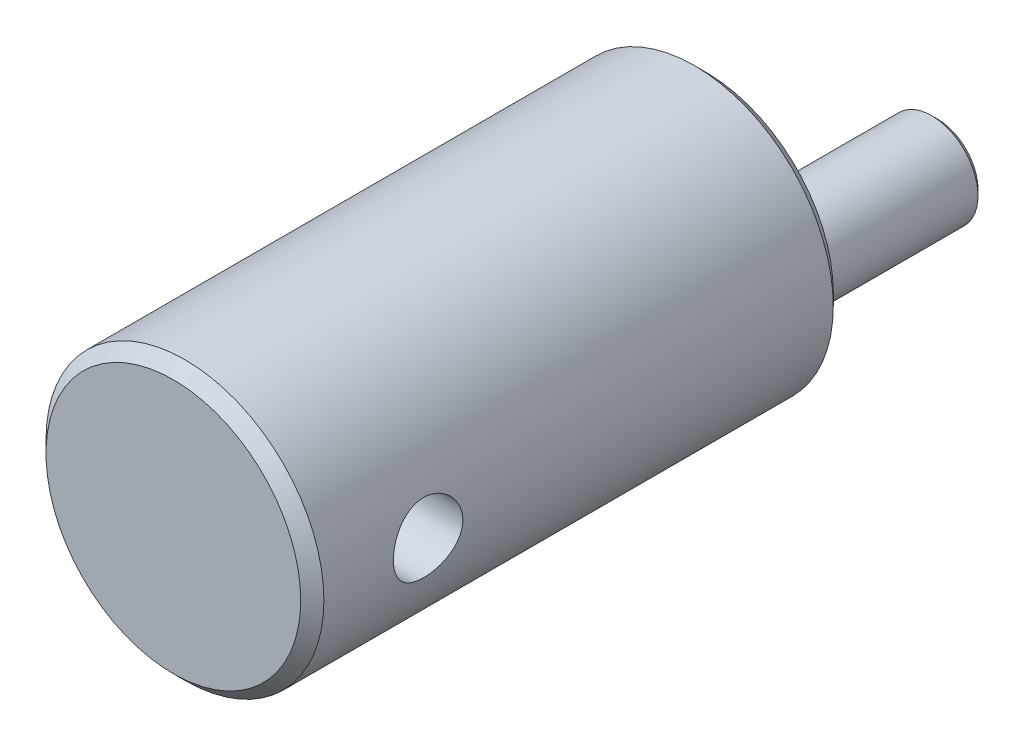
ISO-10303-21;
HEADER;
FILE_DESCRIPTION(('STEP AP214'),'2;1');
FILE_NAME('part.step','',(''),(''),'','','');
FILE_SCHEMA(('AUTOMOTIVE_DESIGN { 1 0 10303 214 1 1 1 1 }'));
ENDSEC;
DATA;
#1=APPLICATION_CONTEXT('core data for automotive mechanical design processes');
#2=APPLICATION_PROTOCOL_DEFINITION('international standard','automotive_design',2000,#1);
#3=PRODUCT_CONTEXT('',#1,'mechanical');
#4=PRODUCT('Part','Part','',(#3));
#5=PRODUCT_RELATED_PRODUCT_CATEGORY('part','',(#4));
#6=PRODUCT_DEFINITION_FORMATION('','',#4);
#7=PRODUCT_DEFINITION_CONTEXT('part definition',#1,'design');
#8=PRODUCT_DEFINITION('design','',#6,#7);
#9=PRODUCT_DEFINITION_SHAPE('','',#8);
#10=(LENGTH_UNIT() NAMED_UNIT(*) SI_UNIT(.MILLI.,.METRE.));
#11=(NAMED_UNIT(*) PLANE_ANGLE_UNIT() SI_UNIT($,.RADIAN.));
#12=(NAMED_UNIT(*) SI_UNIT($,.STERADIAN.) SOLID_ANGLE_UNIT());
#13=UNCERTAINTY_MEASURE_WITH_UNIT(LENGTH_MEASURE(1.E-05),#10,'distance_accuracy_value','');
#14=(GEOMETRIC_REPRESENTATION_CONTEXT(3) GLOBAL_UNCERTAINTY_ASSIGNED_CONTEXT((#13)) GLOBAL_UNIT_ASSIGNED_CONTEXT((#10,
#11,#12)) REPRESENTATION_CONTEXT('',''));
#15=CARTESIAN_POINT('',(0.,0.,0.));
#16=DIRECTION('',(0.,0.,1.));
#17=DIRECTION('',(1.,0.,0.));
#18=AXIS2_PLACEMENT_3D('',#15,#16,#17);
#19=CARTESIAN_POINT('',(0.,0.,23.));
#20=DIRECTION('',(0.,0.,-1.));
#21=DIRECTION('',(-1.,0.,0.));
#22=AXIS2_PLACEMENT_3D('',#19,#20,#21);
#23=CYLINDRICAL_SURFACE('',#22,6.);
#24=CARTESIAN_POINT('',(0.,0.,0.5));
#25=DIRECTION('',(0.,0.,1.));
#26=DIRECTION('',(1.,0.,0.));
#27=AXIS2_PLACEMENT_3D('',#24,#25,#26);
#28=CIRCLE('',#27,6.);
#29=CARTESIAN_POINT('',(6.,0.,0.5));
#30=VERTEX_POINT('',#29);
#31=EDGE_CURVE('E108',#30,#30,#28,.T.);
#32=ORIENTED_EDGE('',*,*,#31,.T.);
#33=EDGE_LOOP('',(#32));
#34=FACE_BOUND('',#33,.T.);
#35=CARTESIAN_POINT('',(0.,0.,22.5));
#36=DIRECTION('',(0.,0.,1.));
#37=DIRECTION('',(1.,0.,0.));
#38=AXIS2_PLACEMENT_3D('',#35,#36,#37);
#39=CIRCLE('',#38,6.);
#40=CARTESIAN_POINT('',(6.,0.,22.5));
#41=VERTEX_POINT('',#40);
#42=EDGE_CURVE('E70',#41,#41,#39,.F.);
#43=ORIENTED_EDGE('',*,*,#42,.T.);
#44=EDGE_LOOP('',(#43));
#45=FACE_BOUND('',#44,.T.);
#46=CARTESIAN_POINT('',(-6.,0.,19.5));
#47=CARTESIAN_POINT('',(-5.99999859868012,0.082876088669731,19.4999976742618));
#48=CARTESIAN_POINT('',(-5.99826578131828,0.165778157830763,19.4931084492262));
#49=CARTESIAN_POINT('',(-5.99152113829892,0.329206323770533,19.465774848693));
#50=CARTESIAN_POINT('',(-5.98650745419968,0.409731046870739,19.4453227904621));
#51=CARTESIAN_POINT('',(-5.9737562633204,0.566020872182577,19.3915607465379));
#52=CARTESIAN_POINT('',(-5.96602202842087,0.641791563430003,19.3582662012847));
#53=CARTESIAN_POINT('',(-5.94865343807593,0.786672131904426,19.2798186099552));
#54=CARTESIAN_POINT('',(-5.9390190185405,0.855781784348759,19.2346651638811));
#55=CARTESIAN_POINT('',(-5.91867413591801,0.98680192730092,19.1327992103458));
#56=CARTESIAN_POINT('',(-5.90794707148533,1.04855569006107,19.0758884250408));
#57=CARTESIAN_POINT('',(-5.88673620117529,1.1617489272033,18.9525477950911));
#58=CARTESIAN_POINT('',(-5.87625242288348,1.21318723694913,18.8861168770535));
#59=CARTESIAN_POINT('',(-5.8565477569971,1.30502654279903,18.7444047732626));
#60=CARTESIAN_POINT('',(-5.84734794470605,1.34525221592536,18.6690067691896));
#61=CARTESIAN_POINT('',(-5.83149494812223,1.41239690855053,18.5122515883416));
#62=CARTESIAN_POINT('',(-5.82484135672789,1.43931805543933,18.4308953666742));
#63=CARTESIAN_POINT('',(-5.81500476717551,1.47855483680429,18.2662565017975));
#64=CARTESIAN_POINT('',(-5.81175491075426,1.49115226833334,18.1830451039502));
#65=CARTESIAN_POINT('',(-5.80889362537741,1.50226177506785,18.015631430986));
#66=CARTESIAN_POINT('',(-5.80928160448644,1.50077614181798,17.9314293193014));
#67=CARTESIAN_POINT('',(-5.81359205496618,1.48398652463928,17.7665841922555));
#68=CARTESIAN_POINT('',(-5.81742863001879,1.46901834019052,17.6859043785349));
#69=CARTESIAN_POINT('',(-5.82806709676483,1.42622418690311,17.5282389490887));
#70=CARTESIAN_POINT('',(-5.83486919970696,1.39839730206942,17.451253596971));
#71=CARTESIAN_POINT('',(-5.85075113904186,1.33038947793715,17.3022619837479));
#72=CARTESIAN_POINT('',(-5.85985327469421,1.29008666723291,17.2303138282104));
#73=CARTESIAN_POINT('',(-5.87929710846386,1.19835627601496,17.0940812902432));
#74=CARTESIAN_POINT('',(-5.88963902334735,1.14692674880884,17.0297982519327));
#75=CARTESIAN_POINT('',(-5.91075880539781,1.03266342468122,16.9087963843056));
#76=CARTESIAN_POINT('',(-5.92154069477971,0.969546258165863,16.8523455099387));
#77=CARTESIAN_POINT('',(-5.94205965578786,0.834611917503703,16.7507787575361));
#78=CARTESIAN_POINT('',(-5.95179669549415,0.762794477707947,16.7056632257364));
#79=CARTESIAN_POINT('',(-5.96917732094182,0.612115888681394,16.6279494137756));
#80=CARTESIAN_POINT('',(-5.97681360127725,0.533231393208626,16.5953946597456));
#81=CARTESIAN_POINT('',(-5.98907916991418,0.370876008142885,16.5440826942904));
#82=CARTESIAN_POINT('',(-5.99370903339281,0.287405999150487,16.5253228435819));
#83=CARTESIAN_POINT('',(-5.99935499271374,0.120539970390028,16.5025424344412));
#84=CARTESIAN_POINT('',(-6.00046053508279,0.0371967199882111,16.4981569739247));
#85=CARTESIAN_POINT('',(-5.99918804814451,-0.129032874801507,16.5032490020555));
#86=CARTESIAN_POINT('',(-5.99681033241846,-0.211919259644594,16.5127252427991));
#87=CARTESIAN_POINT('',(-5.98889581127357,-0.37361426877649,16.5449709083914));
#88=CARTESIAN_POINT('',(-5.98340634185811,-0.452465118968752,16.567541263477));
#89=CARTESIAN_POINT('',(-5.96988706634134,-0.605257292452509,16.6251070840284));
#90=CARTESIAN_POINT('',(-5.96185700369892,-0.679198119032632,16.6601038043132));
#91=CARTESIAN_POINT('',(-5.9439330792631,-0.821523134429846,16.7422361288747));
#92=CARTESIAN_POINT('',(-5.93400867366932,-0.88978544183583,16.7895761123968));
#93=CARTESIAN_POINT('',(-5.91344509187419,-1.01752661364325,16.894789908797));
#94=CARTESIAN_POINT('',(-5.90280579251705,-1.07700395897301,16.9526655396169));
#95=CARTESIAN_POINT('',(-5.88168956960771,-1.18699056807273,17.0790019608445));
#96=CARTESIAN_POINT('',(-5.87122304187281,-1.23724386762203,17.1476877030024));
#97=CARTESIAN_POINT('',(-5.85192878377239,-1.3255107590127,17.2927326344657));
#98=CARTESIAN_POINT('',(-5.84310098067026,-1.36352489415794,17.3690914829598));
#99=CARTESIAN_POINT('',(-5.82818094734665,-1.42595142060929,17.5269057224131));
#100=CARTESIAN_POINT('',(-5.82207255291905,-1.45044439665407,17.608327628344));
#101=CARTESIAN_POINT('',(-5.81326744090183,-1.48534565995378,17.7743096378891));
#102=CARTESIAN_POINT('',(-5.81056997719936,-1.49575702747866,17.8588690510325));
#103=CARTESIAN_POINT('',(-5.80894901203957,-1.502038590334,18.0261210238552));
#104=CARTESIAN_POINT('',(-5.80991932728264,-1.49831789778012,18.1087974351247));
#105=CARTESIAN_POINT('',(-5.81527909007843,-1.47737727831287,18.272303888668));
#106=CARTESIAN_POINT('',(-5.81966846891857,-1.46015762268677,18.3531339680136));
#107=CARTESIAN_POINT('',(-5.83131260682722,-1.4129313194428,18.5102084590654));
#108=CARTESIAN_POINT('',(-5.83855015236309,-1.38300140468038,18.5864773052402));
#109=CARTESIAN_POINT('',(-5.85507755724829,-1.31126491360507,18.7329653827137));
#110=CARTESIAN_POINT('',(-5.86436770120773,-1.26945669003419,18.8031837731869));
#111=CARTESIAN_POINT('',(-5.88425634263512,-1.17386774863714,18.937554629002));
#112=CARTESIAN_POINT('',(-5.89488264831757,-1.11980316291226,19.001501073424));
#113=CARTESIAN_POINT('',(-5.91608027246286,-1.00178937118974,19.1195470447954));
#114=CARTESIAN_POINT('',(-5.92665157727059,-0.937837821261146,19.173644230113));
#115=CARTESIAN_POINT('',(-5.94677655647663,-0.800467586702591,19.2714113085646));
#116=CARTESIAN_POINT('',(-5.95630833365868,-0.726898422316388,19.3148746136716));
#117=CARTESIAN_POINT('',(-5.97304924975118,-0.573266059510478,19.3887474629405));
#118=CARTESIAN_POINT('',(-5.98026005199781,-0.493207563436742,19.4191663606485));
#119=CARTESIAN_POINT('',(-5.99048059565541,-0.344410253243473,19.4615718303296));
#120=CARTESIAN_POINT('',(-5.9940258505269,-0.276380170908069,19.4759512430534));
#121=CARTESIAN_POINT('',(-5.99878605231948,-0.138906071536283,19.4951659436219));
#122=CARTESIAN_POINT('',(-6.00000117450894,-0.0694621612426164,19.5000019493053));
#123=CARTESIAN_POINT('',(-6.,0.,19.5));
#124=B_SPLINE_CURVE_WITH_KNOTS('',3,(#46,#47,#48,#49,#50,#51,#52,#53,#54,#55,#56,#57,#58,#59,
#60,#61,#62,#63,#64,#65,#66,#67,#68,#69,#70,#71,#72,#73,#74,#75,#76,#77,#78,#79,#80,#81,#82,#83,
#84,#85,#86,#87,#88,#89,#90,#91,#92,#93,#94,#95,#96,#97,#98,#99,#100,#101,#102,#103,#104,#105,
#106,#107,#108,#109,#110,#111,#112,#113,#114,#115,#116,#117,#118,#119,#120,#121,#122,#123),
.UNSPECIFIED.,.T.,.F.,(4,2,2,2,2,2,2,2,2,2,2,2,2,2,2,2,2,2,2,2,2,2,2,2,2,2,2,2,2,2,2,2,2,2,2,2,
2,2,4),(0.,0.24837371247189,0.496888237763899,0.745104902286106,0.993329940169328,
1.24614435437139,1.49898729580062,1.75558647545807,2.01214461169369,2.2635629509943,
2.51494038112697,2.76022497007018,3.00552703466038,3.25330527873879,3.50112690836162,
3.75601500969019,4.01091089558247,4.26668229009114,4.52240473688643,4.77158308949276,
5.02073901112743,5.26620274514037,5.5116912732229,5.76153587565352,6.01142363008019,
6.26744509204476,6.52345518749508,6.77792254614037,7.03233423252408,7.27943780398613,
7.52653640956034,7.77216400559448,8.01782568136901,8.2698957640991,8.52202569770418,
8.77872185499588,9.0352336382135,9.24342242942149,9.4515955604304),.UNSPECIFIED.);
#125=CARTESIAN_POINT('',(-6.,0.,19.5));
#126=VERTEX_POINT('',#125);
#127=EDGE_CURVE('E58',#126,#126,#124,.T.);
#128=ORIENTED_EDGE('',*,*,#127,.F.);
#129=EDGE_LOOP('',(#128));
#130=FACE_BOUND('',#129,.T.);
#131=CARTESIAN_POINT('',(6.,0.,19.5));
#132=CARTESIAN_POINT('',(5.99999859868013,-0.082876088669731,19.4999976742618));
#133=CARTESIAN_POINT('',(5.99826578131828,-0.165778157830763,19.4931084492262));
#134=CARTESIAN_POINT('',(5.99152113829892,-0.329206323770532,19.465774848693));
#135=CARTESIAN_POINT('',(5.98650745419968,-0.409731046870739,19.4453227904621));
#136=CARTESIAN_POINT('',(5.9737562633204,-0.566020872182577,19.3915607465379));
#137=CARTESIAN_POINT('',(5.96602202842087,-0.641791563430003,19.3582662012847));
#138=CARTESIAN_POINT('',(5.94865343807593,-0.786672131904426,19.2798186099552));
#139=CARTESIAN_POINT('',(5.9390190185405,-0.855781784348759,19.2346651638811));
#140=CARTESIAN_POINT('',(5.91867413591801,-0.98680192730092,19.1327992103458));
#141=CARTESIAN_POINT('',(5.90794707148533,-1.04855569006107,19.0758884250408));
#142=CARTESIAN_POINT('',(5.88673620117529,-1.1617489272033,18.9525477950911));
#143=CARTESIAN_POINT('',(5.87625242288348,-1.21318723694913,18.8861168770535));
#144=CARTESIAN_POINT('',(5.8565477569971,-1.30502654279903,18.7444047732626));
#145=CARTESIAN_POINT('',(5.84734794470605,-1.34525221592536,18.6690067691896));
#146=CARTESIAN_POINT('',(5.83149494812223,-1.41239690855053,18.5122515883416));
#147=CARTESIAN_POINT('',(5.82484135672789,-1.43931805543933,18.4308953666742));
#148=CARTESIAN_POINT('',(5.81500476717551,-1.47855483680429,18.2662565017975));
#149=CARTESIAN_POINT('',(5.81175491075426,-1.49115226833334,18.1830451039502));
#150=CARTESIAN_POINT('',(5.80889362537741,-1.50226177506785,18.015631430986));
#151=CARTESIAN_POINT('',(5.80928160448644,-1.50077614181798,17.9314293193014));
#152=CARTESIAN_POINT('',(5.81359205496618,-1.48398652463928,17.7665841922555));
#153=CARTESIAN_POINT('',(5.81742863001879,-1.46901834019052,17.6859043785349));
#154=CARTESIAN_POINT('',(5.82806709676483,-1.42622418690311,17.5282389490887));
#155=CARTESIAN_POINT('',(5.83486919970696,-1.39839730206942,17.451253596971));
#156=CARTESIAN_POINT('',(5.85075113904186,-1.33038947793715,17.3022619837479));
#157=CARTESIAN_POINT('',(5.85985327469421,-1.29008666723291,17.2303138282104));
#158=CARTESIAN_POINT('',(5.87929710846386,-1.19835627601496,17.0940812902432));
#159=CARTESIAN_POINT('',(5.88963902334735,-1.14692674880884,17.0297982519327));
#160=CARTESIAN_POINT('',(5.91075880539781,-1.03266342468122,16.9087963843056));
#161=CARTESIAN_POINT('',(5.92154069477971,-0.969546258165863,16.8523455099387));
#162=CARTESIAN_POINT('',(5.94205965578786,-0.834611917503703,16.7507787575361));
#163=CARTESIAN_POINT('',(5.95179669549415,-0.762794477707947,16.7056632257364));
#164=CARTESIAN_POINT('',(5.96917732094182,-0.612115888681394,16.6279494137756));
#165=CARTESIAN_POINT('',(5.97681360127725,-0.533231393208626,16.5953946597456));
#166=CARTESIAN_POINT('',(5.98907916991418,-0.370876008142885,16.5440826942904));
#167=CARTESIAN_POINT('',(5.99370903339281,-0.287405999150487,16.5253228435819));
#168=CARTESIAN_POINT('',(5.99935499271374,-0.120539970390028,16.5025424344412));
#169=CARTESIAN_POINT('',(6.00046053508279,-0.0371967199882111,16.4981569739247));
#170=CARTESIAN_POINT('',(5.99918804814451,0.129032874801507,16.5032490020555));
#171=CARTESIAN_POINT('',(5.99681033241846,0.211919259644594,16.5127252427991));
#172=CARTESIAN_POINT('',(5.98889581127357,0.37361426877649,16.5449709083914));
#173=CARTESIAN_POINT('',(5.98340634185811,0.452465118968752,16.567541263477));
#174=CARTESIAN_POINT('',(5.96988706634134,0.605257292452509,16.6251070840284));
#175=CARTESIAN_POINT('',(5.96185700369892,0.679198119032632,16.6601038043132));
#176=CARTESIAN_POINT('',(5.9439330792631,0.821523134429846,16.7422361288747));
#177=CARTESIAN_POINT('',(5.93400867366932,0.88978544183583,16.7895761123968));
#178=CARTESIAN_POINT('',(5.91344509187419,1.01752661364325,16.894789908797));
#179=CARTESIAN_POINT('',(5.90280579251705,1.07700395897301,16.9526655396169));
#180=CARTESIAN_POINT('',(5.88168956960771,1.18699056807273,17.0790019608445));
#181=CARTESIAN_POINT('',(5.87122304187281,1.23724386762203,17.1476877030024));
#182=CARTESIAN_POINT('',(5.85192878377239,1.3255107590127,17.2927326344657));
#183=CARTESIAN_POINT('',(5.84310098067026,1.36352489415794,17.3690914829598));
#184=CARTESIAN_POINT('',(5.82818094734665,1.42595142060929,17.5269057224131));
#185=CARTESIAN_POINT('',(5.82207255291905,1.45044439665407,17.608327628344));
#186=CARTESIAN_POINT('',(5.81326744090183,1.48534565995378,17.7743096378891));
#187=CARTESIAN_POINT('',(5.81056997719936,1.49575702747866,17.8588690510325));
#188=CARTESIAN_POINT('',(5.80894901203957,1.502038590334,18.0261210238552));
#189=CARTESIAN_POINT('',(5.80991932728264,1.49831789778012,18.1087974351247));
#190=CARTESIAN_POINT('',(5.81527909007843,1.47737727831287,18.272303888668));
#191=CARTESIAN_POINT('',(5.81966846891857,1.46015762268677,18.3531339680136));
#192=CARTESIAN_POINT('',(5.83131260682722,1.4129313194428,18.5102084590654));
#193=CARTESIAN_POINT('',(5.83855015236309,1.38300140468038,18.5864773052402));
#194=CARTESIAN_POINT('',(5.85507755724829,1.31126491360507,18.7329653827137));
#195=CARTESIAN_POINT('',(5.86436770120773,1.26945669003419,18.8031837731869));
#196=CARTESIAN_POINT('',(5.88425634263512,1.17386774863714,18.937554629002));
#197=CARTESIAN_POINT('',(5.89488264831757,1.11980316291226,19.001501073424));
#198=CARTESIAN_POINT('',(5.91608027246286,1.00178937118974,19.1195470447954));
#199=CARTESIAN_POINT('',(5.92665157727059,0.937837821261146,19.173644230113));
#200=CARTESIAN_POINT('',(5.94677655647663,0.800467586702591,19.2714113085646));
#201=CARTESIAN_POINT('',(5.95630833365868,0.726898422316388,19.3148746136716));
#202=CARTESIAN_POINT('',(5.97304924975118,0.573266059510478,19.3887474629405));
#203=CARTESIAN_POINT('',(5.98026005199781,0.493207563436742,19.4191663606485));
#204=CARTESIAN_POINT('',(5.99048059565541,0.344410253243473,19.4615718303296));
#205=CARTESIAN_POINT('',(5.9940258505269,0.276380170908069,19.4759512430534));
#206=CARTESIAN_POINT('',(5.99878605231948,0.138906071536283,19.4951659436219));
#207=CARTESIAN_POINT('',(6.00000117450894,0.0694621612426164,19.5000019493053));
#208=CARTESIAN_POINT('',(6.,0.,19.5));
#209=B_SPLINE_CURVE_WITH_KNOTS('',3,(#131,#132,#133,#134,#135,#136,#137,#138,#139,#140,#141,
#142,#143,#144,#145,#146,#147,#148,#149,#150,#151,#152,#153,#154,#155,#156,#157,#158,#159,#160,
#161,#162,#163,#164,#165,#166,#167,#168,#169,#170,#171,#172,#173,#174,#175,#176,#177,#178,#179,
#180,#181,#182,#183,#184,#185,#186,#187,#188,#189,#190,#191,#192,#193,#194,#195,#196,#197,#198,
#199,#200,#201,#202,#203,#204,#205,#206,#207,#208),.UNSPECIFIED.,.T.,.F.,(4,2,2,2,2,2,2,2,2,2,2,
2,2,2,2,2,2,2,2,2,2,2,2,2,2,2,2,2,2,2,2,2,2,2,2,2,2,2,4),(0.,0.24837371247189,0.496888237763899,
0.745104902286106,0.993329940169328,1.24614435437139,1.49898729580062,1.75558647545807,
2.01214461169369,2.2635629509943,2.51494038112697,2.76022497007018,3.00552703466038,
3.25330527873879,3.50112690836162,3.75601500969019,4.01091089558247,4.26668229009114,
4.52240473688643,4.77158308949276,5.02073901112743,5.26620274514037,5.5116912732229,
5.76153587565352,6.01142363008019,6.26744509204476,6.52345518749508,6.77792254614037,
7.03233423252408,7.27943780398613,7.52653640956034,7.77216400559448,8.01782568136901,
8.2698957640991,8.52202569770418,8.77872185499588,9.0352336382135,9.24342242942149,
9.4515955604304),.UNSPECIFIED.);
#210=CARTESIAN_POINT('',(6.,0.,19.5));
#211=VERTEX_POINT('',#210);
#212=EDGE_CURVE('E61',#211,#211,#209,.T.);
#213=ORIENTED_EDGE('',*,*,#212,.F.);
#214=EDGE_LOOP('',(#213));
#215=FACE_BOUND('',#214,.T.);
#216=ADVANCED_FACE('F39',(#34,#45,#130,#215),#23,.T.);
#217=CARTESIAN_POINT('',(0.,0.,23.));
#218=DIRECTION('',(0.,0.,1.));
#219=DIRECTION('',(1.,0.,0.));
#220=AXIS2_PLACEMENT_3D('',#217,#218,#219);
#221=PLANE('',#220);
#222=CARTESIAN_POINT('',(0.,0.,23.));
#223=DIRECTION('',(0.,0.,1.));
#224=DIRECTION('',(1.,0.,0.));
#225=AXIS2_PLACEMENT_3D('',#222,#223,#224);
#226=CIRCLE('',#225,5.50000000000001);
#227=CARTESIAN_POINT('',(5.50000000000001,0.,23.));
#228=VERTEX_POINT('',#227);
#229=EDGE_CURVE('E118',#228,#228,#226,.T.);
#230=ORIENTED_EDGE('',*,*,#229,.T.);
#231=EDGE_LOOP('',(#230));
#232=FACE_BOUND('',#231,.T.);
#233=ADVANCED_FACE('F87',(#232),#221,.T.);
#234=CARTESIAN_POINT('',(0.,0.,0.));
#235=DIRECTION('',(0.,0.,1.));
#236=DIRECTION('',(1.,0.,0.));
#237=AXIS2_PLACEMENT_3D('',#234,#235,#236);
#238=PLANE('',#237);
#239=CARTESIAN_POINT('',(0.,-3.,0.));
#240=DIRECTION('',(0.,0.,1.));
#241=DIRECTION('',(1.,0.,0.));
#242=AXIS2_PLACEMENT_3D('',#239,#240,#241);
#243=CIRCLE('',#242,2.);
#244=CARTESIAN_POINT('',(2.,-3.,0.));
#245=VERTEX_POINT('',#244);
#246=EDGE_CURVE('E53',#245,#245,#243,.F.);
#247=ORIENTED_EDGE('',*,*,#246,.F.);
#248=EDGE_LOOP('',(#247));
#249=FACE_BOUND('',#248,.T.);
#250=CARTESIAN_POINT('',(0.,0.,0.));
#251=DIRECTION('',(0.,0.,1.));
#252=DIRECTION('',(1.,0.,0.));
#253=AXIS2_PLACEMENT_3D('',#250,#251,#252);
#254=CIRCLE('',#253,5.5);
#255=CARTESIAN_POINT('',(5.5,0.,0.));
#256=VERTEX_POINT('',#255);
#257=EDGE_CURVE('E121',#256,#256,#254,.F.);
#258=ORIENTED_EDGE('',*,*,#257,.T.);
#259=EDGE_LOOP('',(#258));
#260=FACE_BOUND('',#259,.T.);
#261=ADVANCED_FACE('F90',(#249,#260),#238,.F.);
#262=CARTESIAN_POINT('',(0.,0.,0.5));
#263=DIRECTION('',(0.,0.,1.));
#264=DIRECTION('',(1.,0.,0.));
#265=AXIS2_PLACEMENT_3D('',#262,#263,#264);
#266=CONICAL_SURFACE('',#265,6.,0.785398163397449);
#267=ORIENTED_EDGE('',*,*,#257,.F.);
#268=EDGE_LOOP('',(#267));
#269=FACE_BOUND('',#268,.T.);
#270=ORIENTED_EDGE('',*,*,#31,.F.);
#271=EDGE_LOOP('',(#270));
#272=FACE_BOUND('',#271,.T.);
#273=ADVANCED_FACE('F93',(#269,#272),#266,.T.);
#274=CARTESIAN_POINT('',(0.,0.,23.));
#275=DIRECTION('',(0.,0.,-1.));
#276=DIRECTION('',(-1.,0.,0.));
#277=AXIS2_PLACEMENT_3D('',#274,#275,#276);
#278=CONICAL_SURFACE('',#277,5.50000000000001,0.785398163397446);
#279=ORIENTED_EDGE('',*,*,#42,.F.);
#280=EDGE_LOOP('',(#279));
#281=FACE_BOUND('',#280,.T.);
#282=ORIENTED_EDGE('',*,*,#229,.F.);
#283=EDGE_LOOP('',(#282));
#284=FACE_BOUND('',#283,.T.);
#285=ADVANCED_FACE('F84',(#281,#284),#278,.T.);
#286=CARTESIAN_POINT('',(17.,0.,18.));
#287=DIRECTION('',(-1.,0.,0.));
#288=DIRECTION('',(0.,0.,1.));
#289=AXIS2_PLACEMENT_3D('',#286,#287,#288);
#290=CYLINDRICAL_SURFACE('',#289,1.5);
#291=ORIENTED_EDGE('',*,*,#212,.T.);
#292=EDGE_LOOP('',(#291));
#293=FACE_BOUND('',#292,.T.);
#294=ORIENTED_EDGE('',*,*,#127,.T.);
#295=EDGE_LOOP('',(#294));
#296=FACE_BOUND('',#295,.T.);
#297=ADVANCED_FACE('F78',(#293,#296),#290,.F.);
#298=CARTESIAN_POINT('',(0.,-3.,-10.));
#299=DIRECTION('',(0.,0.,1.));
#300=DIRECTION('',(1.,0.,0.));
#301=AXIS2_PLACEMENT_3D('',#298,#299,#300);
#302=CYLINDRICAL_SURFACE('',#301,2.);
#303=CARTESIAN_POINT('',(0.,-3.,-9.75000000000001));
#304=DIRECTION('',(0.,0.,-1.));
#305=DIRECTION('',(-1.,0.,0.));
#306=AXIS2_PLACEMENT_3D('',#303,#304,#305);
#307=CIRCLE('',#306,2.);
#308=CARTESIAN_POINT('',(-2.,-3.,-9.75000000000001));
#309=VERTEX_POINT('',#308);
#310=EDGE_CURVE('E10',#309,#309,#307,.F.);
#311=ORIENTED_EDGE('',*,*,#310,.T.);
#312=EDGE_LOOP('',(#311));
#313=FACE_BOUND('',#312,.T.);
#314=ORIENTED_EDGE('',*,*,#246,.T.);
#315=EDGE_LOOP('',(#314));
#316=FACE_BOUND('',#315,.T.);
#317=ADVANCED_FACE('F83',(#313,#316),#302,.T.);
#318=CARTESIAN_POINT('',(0.,-3.,-10.));
#319=DIRECTION('',(0.,0.,-1.));
#320=DIRECTION('',(-1.,0.,0.));
#321=AXIS2_PLACEMENT_3D('',#318,#319,#320);
#322=PLANE('',#321);
#323=CARTESIAN_POINT('',(0.,-3.,-10.));
#324=DIRECTION('',(0.,0.,-1.));
#325=DIRECTION('',(-1.,0.,0.));
#326=AXIS2_PLACEMENT_3D('',#323,#324,#325);
#327=CIRCLE('',#326,1.75000000000001);
#328=CARTESIAN_POINT('',(-1.75000000000001,-3.,-10.));
#329=VERTEX_POINT('',#328);
#330=EDGE_CURVE('E48',#329,#329,#327,.T.);
#331=ORIENTED_EDGE('',*,*,#330,.T.);
#332=EDGE_LOOP('',(#331));
#333=FACE_BOUND('',#332,.T.);
#334=ADVANCED_FACE('F157',(#333),#322,.T.);
#335=CARTESIAN_POINT('',(0.,-3.,-10.));
#336=DIRECTION('',(0.,0.,1.));
#337=DIRECTION('',(1.,0.,0.));
#338=AXIS2_PLACEMENT_3D('',#335,#336,#337);
#339=CONICAL_SURFACE('',#338,1.75000000000001,0.785398163397448);
#340=ORIENTED_EDGE('',*,*,#310,.F.);
#341=EDGE_LOOP('',(#340));
#342=FACE_BOUND('',#341,.T.);
#343=ORIENTED_EDGE('',*,*,#330,.F.);
#344=EDGE_LOOP('',(#343));
#345=FACE_BOUND('',#344,.T.);
#346=ADVANCED_FACE('F42',(#342,#345),#339,.T.);
#347=CLOSED_SHELL('',(#216,#233,#261,#273,#285,#297,#317,#334,#346));
#348=MANIFOLD_SOLID_BREP('B2',#347);
#349=ADVANCED_BREP_SHAPE_REPRESENTATION('',(#18,#348),#14);
#350=SHAPE_DEFINITION_REPRESENTATION(#9,#349);
ENDSEC;
END-ISO-10303-21;
